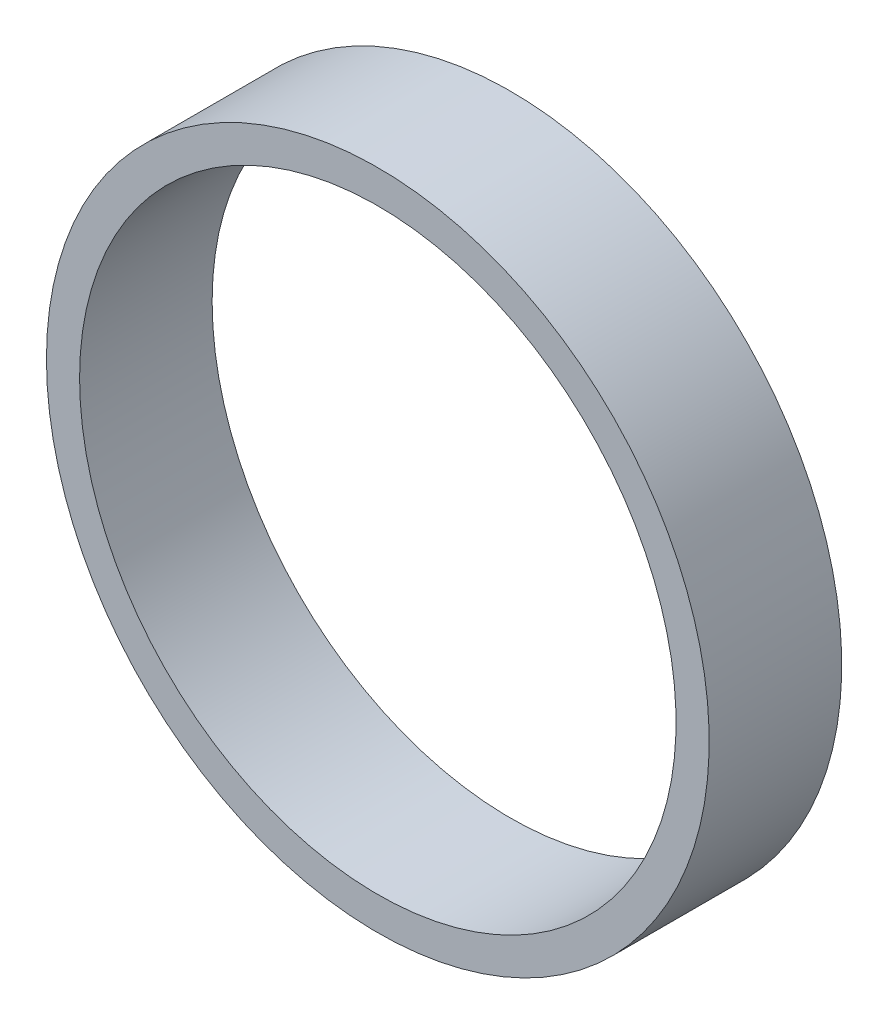
ISO-10303-21;
HEADER;
FILE_DESCRIPTION(('STEP AP214'),'2;1');
FILE_NAME('part.step','',(''),(''),'','','');
FILE_SCHEMA(('AUTOMOTIVE_DESIGN { 1 0 10303 214 1 1 1 1 }'));
ENDSEC;
DATA;
#1=APPLICATION_CONTEXT('core data for automotive mechanical design processes');
#2=APPLICATION_PROTOCOL_DEFINITION('international standard','automotive_design',2000,#1);
#3=PRODUCT_CONTEXT('',#1,'mechanical');
#4=PRODUCT('Part','Part','',(#3));
#5=PRODUCT_RELATED_PRODUCT_CATEGORY('part','',(#4));
#6=PRODUCT_DEFINITION_FORMATION('','',#4);
#7=PRODUCT_DEFINITION_CONTEXT('part definition',#1,'design');
#8=PRODUCT_DEFINITION('design','',#6,#7);
#9=PRODUCT_DEFINITION_SHAPE('','',#8);
#10=(LENGTH_UNIT() NAMED_UNIT(*) SI_UNIT(.MILLI.,.METRE.));
#11=(NAMED_UNIT(*) PLANE_ANGLE_UNIT() SI_UNIT($,.RADIAN.));
#12=(NAMED_UNIT(*) SI_UNIT($,.STERADIAN.) SOLID_ANGLE_UNIT());
#13=UNCERTAINTY_MEASURE_WITH_UNIT(LENGTH_MEASURE(1.E-05),#10,'distance_accuracy_value','');
#14=(GEOMETRIC_REPRESENTATION_CONTEXT(3) GLOBAL_UNCERTAINTY_ASSIGNED_CONTEXT((#13)) GLOBAL_UNIT_ASSIGNED_CONTEXT((#10,
#11,#12)) REPRESENTATION_CONTEXT('',''));
#15=CARTESIAN_POINT('',(0.,0.,0.));
#16=DIRECTION('',(0.,0.,1.));
#17=DIRECTION('',(1.,0.,0.));
#18=AXIS2_PLACEMENT_3D('',#15,#16,#17);
#19=CARTESIAN_POINT('',(0.,0.,-132.376712775731));
#20=DIRECTION('',(0.,0.,-1.));
#21=DIRECTION('',(-1.,0.,0.));
#22=AXIS2_PLACEMENT_3D('',#19,#20,#21);
#23=CYLINDRICAL_SURFACE('',#22,50.);
#24=CARTESIAN_POINT('',(0.,0.,10.));
#25=DIRECTION('',(0.,0.,-1.));
#26=DIRECTION('',(-1.,0.,0.));
#27=AXIS2_PLACEMENT_3D('',#24,#25,#26);
#28=CIRCLE('',#27,50.);
#29=CARTESIAN_POINT('',(-50.,0.,10.));
#30=VERTEX_POINT('',#29);
#31=EDGE_CURVE('E10',#30,#30,#28,.T.);
#32=ORIENTED_EDGE('',*,*,#31,.T.);
#33=EDGE_LOOP('',(#32));
#34=FACE_BOUND('',#33,.T.);
#35=CARTESIAN_POINT('',(0.,0.,-9.99999999999999));
#36=DIRECTION('',(0.,0.,-1.));
#37=DIRECTION('',(-1.,0.,0.));
#38=AXIS2_PLACEMENT_3D('',#35,#36,#37);
#39=CIRCLE('',#38,50.);
#40=CARTESIAN_POINT('',(-50.,0.,-9.99999999999999));
#41=VERTEX_POINT('',#40);
#42=EDGE_CURVE('E46',#41,#41,#39,.T.);
#43=ORIENTED_EDGE('',*,*,#42,.F.);
#44=EDGE_LOOP('',(#43));
#45=FACE_BOUND('',#44,.T.);
#46=ADVANCED_FACE('F32',(#34,#45),#23,.T.);
#47=CARTESIAN_POINT('',(-50.,0.,10.));
#48=DIRECTION('',(0.,0.,1.));
#49=DIRECTION('',(1.,0.,0.));
#50=AXIS2_PLACEMENT_3D('',#47,#48,#49);
#51=PLANE('',#50);
#52=CARTESIAN_POINT('',(0.,0.,10.));
#53=DIRECTION('',(0.,0.,-1.));
#54=DIRECTION('',(-1.,0.,0.));
#55=AXIS2_PLACEMENT_3D('',#52,#53,#54);
#56=CIRCLE('',#55,45.);
#57=CARTESIAN_POINT('',(-45.,0.,10.));
#58=VERTEX_POINT('',#57);
#59=EDGE_CURVE('E38',#58,#58,#56,.T.);
#60=ORIENTED_EDGE('',*,*,#59,.T.);
#61=EDGE_LOOP('',(#60));
#62=FACE_BOUND('',#61,.T.);
#63=ORIENTED_EDGE('',*,*,#31,.F.);
#64=EDGE_LOOP('',(#63));
#65=FACE_BOUND('',#64,.T.);
#66=ADVANCED_FACE('F56',(#62,#65),#51,.T.);
#67=CARTESIAN_POINT('',(0.,0.,-132.376712775731));
#68=DIRECTION('',(0.,0.,-1.));
#69=DIRECTION('',(-1.,0.,0.));
#70=AXIS2_PLACEMENT_3D('',#67,#68,#69);
#71=CYLINDRICAL_SURFACE('',#70,45.);
#72=CARTESIAN_POINT('',(0.,0.,-9.99999999999999));
#73=DIRECTION('',(0.,0.,-1.));
#74=DIRECTION('',(-1.,0.,0.));
#75=AXIS2_PLACEMENT_3D('',#72,#73,#74);
#76=CIRCLE('',#75,45.);
#77=CARTESIAN_POINT('',(-45.,0.,-9.99999999999999));
#78=VERTEX_POINT('',#77);
#79=EDGE_CURVE('E42',#78,#78,#76,.T.);
#80=ORIENTED_EDGE('',*,*,#79,.T.);
#81=EDGE_LOOP('',(#80));
#82=FACE_BOUND('',#81,.T.);
#83=ORIENTED_EDGE('',*,*,#59,.F.);
#84=EDGE_LOOP('',(#83));
#85=FACE_BOUND('',#84,.T.);
#86=ADVANCED_FACE('F60',(#82,#85),#71,.F.);
#87=CARTESIAN_POINT('',(-50.,0.,-10.));
#88=DIRECTION('',(0.,0.,-1.));
#89=DIRECTION('',(-1.,0.,0.));
#90=AXIS2_PLACEMENT_3D('',#87,#88,#89);
#91=PLANE('',#90);
#92=ORIENTED_EDGE('',*,*,#42,.T.);
#93=EDGE_LOOP('',(#92));
#94=FACE_BOUND('',#93,.T.);
#95=ORIENTED_EDGE('',*,*,#79,.F.);
#96=EDGE_LOOP('',(#95));
#97=FACE_BOUND('',#96,.T.);
#98=ADVANCED_FACE('F52',(#94,#97),#91,.T.);
#99=CLOSED_SHELL('',(#46,#66,#86,#98));
#100=MANIFOLD_SOLID_BREP('B2',#99);
#101=ADVANCED_BREP_SHAPE_REPRESENTATION('',(#18,#100),#14);
#102=SHAPE_DEFINITION_REPRESENTATION(#9,#101);
ENDSEC;
END-ISO-10303-21;
